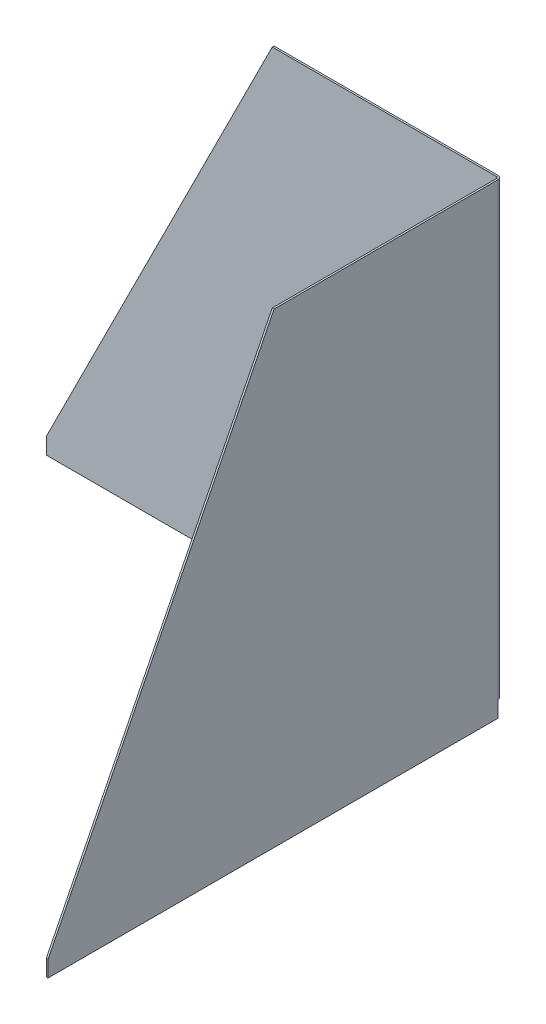
ISO-10303-21;
HEADER;
FILE_DESCRIPTION(('STEP AP214'),'2;1');
FILE_NAME('part.step','',(''),(''),'','','');
FILE_SCHEMA(('AUTOMOTIVE_DESIGN { 1 0 10303 214 1 1 1 1 }'));
ENDSEC;
DATA;
#1=APPLICATION_CONTEXT('core data for automotive mechanical design processes');
#2=APPLICATION_PROTOCOL_DEFINITION('international standard','automotive_design',2000,#1);
#3=PRODUCT_CONTEXT('',#1,'mechanical');
#4=PRODUCT('Part','Part','',(#3));
#5=PRODUCT_RELATED_PRODUCT_CATEGORY('part','',(#4));
#6=PRODUCT_DEFINITION_FORMATION('','',#4);
#7=PRODUCT_DEFINITION_CONTEXT('part definition',#1,'design');
#8=PRODUCT_DEFINITION('design','',#6,#7);
#9=PRODUCT_DEFINITION_SHAPE('','',#8);
#10=(LENGTH_UNIT() NAMED_UNIT(*) SI_UNIT(.MILLI.,.METRE.));
#11=(NAMED_UNIT(*) PLANE_ANGLE_UNIT() SI_UNIT($,.RADIAN.));
#12=(NAMED_UNIT(*) SI_UNIT($,.STERADIAN.) SOLID_ANGLE_UNIT());
#13=UNCERTAINTY_MEASURE_WITH_UNIT(LENGTH_MEASURE(1.E-05),#10,'distance_accuracy_value','');
#14=(GEOMETRIC_REPRESENTATION_CONTEXT(3) GLOBAL_UNCERTAINTY_ASSIGNED_CONTEXT((#13)) GLOBAL_UNIT_ASSIGNED_CONTEXT((#10,
#11,#12)) REPRESENTATION_CONTEXT('',''));
#15=CARTESIAN_POINT('',(0.,0.,0.));
#16=DIRECTION('',(0.,0.,1.));
#17=DIRECTION('',(1.,0.,0.));
#18=AXIS2_PLACEMENT_3D('',#15,#16,#17);
#19=CARTESIAN_POINT('',(-92.4999999999999,498.,92.4999999999999));
#20=DIRECTION('',(0.,-1.,0.));
#21=DIRECTION('',(0.,0.,1.));
#22=AXIS2_PLACEMENT_3D('',#19,#20,#21);
#23=PLANE('',#22);
#24=DIRECTION('',(1.,0.,0.));
#25=VECTOR('',#24,1.);
#26=CARTESIAN_POINT('',(-92.4999999999999,498.,94.4999999999999));
#27=LINE('',#26,#25);
#28=CARTESIAN_POINT('',(-92.4999999999999,498.,94.5));
#29=VERTEX_POINT('',#28);
#30=CARTESIAN_POINT('',(-90.4999999999999,498.,94.5));
#31=VERTEX_POINT('',#30);
#32=EDGE_CURVE('E138',#29,#31,#27,.T.);
#33=ORIENTED_EDGE('',*,*,#32,.F.);
#34=DIRECTION('',(0.,0.,1.));
#35=VECTOR('',#34,1.);
#36=CARTESIAN_POINT('',(-92.4999999999999,498.,92.4999999999999));
#37=LINE('',#36,#35);
#38=CARTESIAN_POINT('',(-92.4999999999999,498.,342.5));
#39=VERTEX_POINT('',#38);
#40=EDGE_CURVE('E155',#29,#39,#37,.T.);
#41=ORIENTED_EDGE('',*,*,#40,.T.);
#42=DIRECTION('',(1.,0.,0.));
#43=VECTOR('',#42,1.);
#44=CARTESIAN_POINT('',(-92.4999999999999,498.,342.5));
#45=LINE('',#44,#43);
#46=CARTESIAN_POINT('',(-90.4999999999999,498.,342.5));
#47=VERTEX_POINT('',#46);
#48=EDGE_CURVE('E58',#39,#47,#45,.T.);
#49=ORIENTED_EDGE('',*,*,#48,.T.);
#50=DIRECTION('',(0.,0.,1.));
#51=VECTOR('',#50,1.);
#52=CARTESIAN_POINT('',(-90.4999999999999,498.,0.));
#53=LINE('',#52,#51);
#54=EDGE_CURVE('E162',#31,#47,#53,.T.);
#55=ORIENTED_EDGE('',*,*,#54,.F.);
#56=EDGE_LOOP('',(#33,#41,#49,#55));
#57=FACE_BOUND('',#56,.T.);
#58=ADVANCED_FACE('F36',(#57),#23,.F.);
#59=CARTESIAN_POINT('',(-92.4999999999999,498.,342.5));
#60=DIRECTION('',(0.,-0.44864869521111,-0.893708200860532));
#61=DIRECTION('',(0.,-0.893708200860532,0.44864869521111));
#62=AXIS2_PLACEMENT_3D('',#59,#60,#61);
#63=PLANE('',#62);
#64=ORIENTED_EDGE('',*,*,#48,.F.);
#65=DIRECTION('',(0.,-0.893708200860532,0.44864869521111));
#66=VECTOR('',#65,1.);
#67=CARTESIAN_POINT('',(-92.4999999999999,498.,342.5));
#68=LINE('',#67,#66);
#69=CARTESIAN_POINT('',(-92.4999999999999,0.,592.5));
#70=VERTEX_POINT('',#69);
#71=EDGE_CURVE('E158',#39,#70,#68,.T.);
#72=ORIENTED_EDGE('',*,*,#71,.T.);
#73=DIRECTION('',(1.,0.,0.));
#74=VECTOR('',#73,1.);
#75=CARTESIAN_POINT('',(-92.4999999999999,0.,592.5));
#76=LINE('',#75,#74);
#77=CARTESIAN_POINT('',(-90.4999999999999,0.,592.5));
#78=VERTEX_POINT('',#77);
#79=EDGE_CURVE('E166',#70,#78,#76,.T.);
#80=ORIENTED_EDGE('',*,*,#79,.T.);
#81=DIRECTION('',(0.,-0.893708200860532,0.44864869521111));
#82=VECTOR('',#81,1.);
#83=CARTESIAN_POINT('',(-90.4999999999999,498.,342.5));
#84=LINE('',#83,#82);
#85=EDGE_CURVE('E159',#47,#78,#84,.T.);
#86=ORIENTED_EDGE('',*,*,#85,.F.);
#87=EDGE_LOOP('',(#64,#72,#80,#86));
#88=FACE_BOUND('',#87,.T.);
#89=ADVANCED_FACE('F251',(#88),#63,.F.);
#90=CARTESIAN_POINT('',(-90.4999999999999,0.,0.));
#91=DIRECTION('',(-1.,0.,0.));
#92=DIRECTION('',(0.,0.,1.));
#93=AXIS2_PLACEMENT_3D('',#90,#91,#92);
#94=PLANE('',#93);
#95=ORIENTED_EDGE('',*,*,#85,.T.);
#96=DIRECTION('',(0.,1.,0.));
#97=VECTOR('',#96,1.);
#98=CARTESIAN_POINT('',(-90.4999999999999,-18.,592.5));
#99=LINE('',#98,#97);
#100=CARTESIAN_POINT('',(-90.4999999999999,-18.,592.5));
#101=VERTEX_POINT('',#100);
#102=EDGE_CURVE('E178',#101,#78,#99,.T.);
#103=ORIENTED_EDGE('',*,*,#102,.F.);
#104=DIRECTION('',(0.,0.,1.));
#105=VECTOR('',#104,1.);
#106=CARTESIAN_POINT('',(-90.4999999999999,-18.,592.5));
#107=LINE('',#106,#105);
#108=CARTESIAN_POINT('',(-90.4999999999999,-18.,94.4999999999999));
#109=VERTEX_POINT('',#108);
#110=EDGE_CURVE('E183',#109,#101,#107,.T.);
#111=ORIENTED_EDGE('',*,*,#110,.F.);
#112=DIRECTION('',(0.,1.,0.));
#113=VECTOR('',#112,1.);
#114=CARTESIAN_POINT('',(-90.4999999999999,-18.,94.4999999999999));
#115=LINE('',#114,#113);
#116=CARTESIAN_POINT('',(-90.4999999999999,0.,94.4999999999999));
#117=VERTEX_POINT('',#116);
#118=EDGE_CURVE('E175',#109,#117,#115,.T.);
#119=ORIENTED_EDGE('',*,*,#118,.T.);
#120=DIRECTION('',(0.,1.,0.));
#121=VECTOR('',#120,1.);
#122=CARTESIAN_POINT('',(-90.4999999999999,0.,94.4999999999999));
#123=LINE('',#122,#121);
#124=EDGE_CURVE('E43',#117,#31,#123,.T.);
#125=ORIENTED_EDGE('',*,*,#124,.T.);
#126=ORIENTED_EDGE('',*,*,#54,.T.);
#127=EDGE_LOOP('',(#95,#103,#111,#119,#125,#126));
#128=FACE_BOUND('',#127,.T.);
#129=ADVANCED_FACE('F243',(#128),#94,.F.);
#130=CARTESIAN_POINT('',(-92.4999999999999,0.,0.));
#131=DIRECTION('',(-1.,0.,0.));
#132=DIRECTION('',(0.,0.,1.));
#133=AXIS2_PLACEMENT_3D('',#130,#131,#132);
#134=PLANE('',#133);
#135=DIRECTION('',(0.,1.,0.));
#136=VECTOR('',#135,1.);
#137=CARTESIAN_POINT('',(-92.4999999999999,0.,94.4999999999999));
#138=LINE('',#137,#136);
#139=CARTESIAN_POINT('',(-92.4999999999999,0.,94.5));
#140=VERTEX_POINT('',#139);
#141=EDGE_CURVE('E148',#140,#29,#138,.T.);
#142=ORIENTED_EDGE('',*,*,#141,.F.);
#143=DIRECTION('',(0.,1.,0.));
#144=VECTOR('',#143,1.);
#145=CARTESIAN_POINT('',(-92.4999999999999,-18.,94.4999999999999));
#146=LINE('',#145,#144);
#147=CARTESIAN_POINT('',(-92.4999999999999,-18.,94.4999999999999));
#148=VERTEX_POINT('',#147);
#149=EDGE_CURVE('E170',#148,#140,#146,.T.);
#150=ORIENTED_EDGE('',*,*,#149,.F.);
#151=DIRECTION('',(0.,0.,-1.));
#152=VECTOR('',#151,1.);
#153=CARTESIAN_POINT('',(-92.4999999999999,-18.,592.5));
#154=LINE('',#153,#152);
#155=CARTESIAN_POINT('',(-92.4999999999999,-18.,592.5));
#156=VERTEX_POINT('',#155);
#157=EDGE_CURVE('E187',#156,#148,#154,.T.);
#158=ORIENTED_EDGE('',*,*,#157,.F.);
#159=DIRECTION('',(0.,1.,0.));
#160=VECTOR('',#159,1.);
#161=CARTESIAN_POINT('',(-92.4999999999999,-18.,592.5));
#162=LINE('',#161,#160);
#163=EDGE_CURVE('E71',#156,#70,#162,.T.);
#164=ORIENTED_EDGE('',*,*,#163,.T.);
#165=ORIENTED_EDGE('',*,*,#71,.F.);
#166=ORIENTED_EDGE('',*,*,#40,.F.);
#167=EDGE_LOOP('',(#142,#150,#158,#164,#165,#166));
#168=FACE_BOUND('',#167,.T.);
#169=ADVANCED_FACE('F156',(#168),#134,.T.);
#170=CARTESIAN_POINT('',(-92.4999999999999,-18.,94.4999999999999));
#171=DIRECTION('',(0.,0.,1.));
#172=DIRECTION('',(0.,-1.,0.));
#173=AXIS2_PLACEMENT_3D('',#170,#171,#172);
#174=PLANE('',#173);
#175=DIRECTION('',(1.,0.,0.));
#176=VECTOR('',#175,1.);
#177=CARTESIAN_POINT('',(-92.4999999999999,0.,94.4999999999999));
#178=LINE('',#177,#176);
#179=EDGE_CURVE('E11',#140,#117,#178,.T.);
#180=ORIENTED_EDGE('',*,*,#179,.T.);
#181=ORIENTED_EDGE('',*,*,#118,.F.);
#182=DIRECTION('',(1.,0.,0.));
#183=VECTOR('',#182,1.);
#184=CARTESIAN_POINT('',(-92.4999999999999,-18.,94.4999999999999));
#185=LINE('',#184,#183);
#186=EDGE_CURVE('E185',#148,#109,#185,.T.);
#187=ORIENTED_EDGE('',*,*,#186,.F.);
#188=ORIENTED_EDGE('',*,*,#149,.T.);
#189=EDGE_LOOP('',(#180,#181,#187,#188));
#190=FACE_BOUND('',#189,.T.);
#191=ADVANCED_FACE('F246',(#190),#174,.F.);
#192=CARTESIAN_POINT('',(-92.4999999999999,-18.,592.5));
#193=DIRECTION('',(0.,0.,-1.));
#194=DIRECTION('',(0.,1.,0.));
#195=AXIS2_PLACEMENT_3D('',#192,#193,#194);
#196=PLANE('',#195);
#197=ORIENTED_EDGE('',*,*,#79,.F.);
#198=ORIENTED_EDGE('',*,*,#163,.F.);
#199=DIRECTION('',(-1.,0.,0.));
#200=VECTOR('',#199,1.);
#201=CARTESIAN_POINT('',(-92.4999999999999,-18.,592.5));
#202=LINE('',#201,#200);
#203=EDGE_CURVE('E79',#101,#156,#202,.T.);
#204=ORIENTED_EDGE('',*,*,#203,.F.);
#205=ORIENTED_EDGE('',*,*,#102,.T.);
#206=EDGE_LOOP('',(#197,#198,#204,#205));
#207=FACE_BOUND('',#206,.T.);
#208=ADVANCED_FACE('F249',(#207),#196,.F.);
#209=CARTESIAN_POINT('',(0.,-18.,0.));
#210=DIRECTION('',(0.,-1.,0.));
#211=DIRECTION('',(1.,0.,0.));
#212=AXIS2_PLACEMENT_3D('',#209,#210,#211);
#213=PLANE('',#212);
#214=ORIENTED_EDGE('',*,*,#157,.T.);
#215=ORIENTED_EDGE('',*,*,#186,.T.);
#216=ORIENTED_EDGE('',*,*,#110,.T.);
#217=ORIENTED_EDGE('',*,*,#203,.T.);
#218=EDGE_LOOP('',(#214,#215,#216,#217));
#219=FACE_BOUND('',#218,.T.);
#220=ADVANCED_FACE('F247',(#219),#213,.T.);
#221=CARTESIAN_POINT('',(0.,-18.,0.));
#222=DIRECTION('',(0.,-1.,0.));
#223=DIRECTION('',(1.,0.,0.));
#224=AXIS2_PLACEMENT_3D('',#221,#222,#223);
#225=PLANE('',#224);
#226=DIRECTION('',(0.,0.,-1.));
#227=VECTOR('',#226,1.);
#228=CARTESIAN_POINT('',(-592.5,-18.,92.5000000000001));
#229=LINE('',#228,#227);
#230=CARTESIAN_POINT('',(-592.5,-18.,92.5000000000001));
#231=VERTEX_POINT('',#230);
#232=CARTESIAN_POINT('',(-592.5,-18.,90.5));
#233=VERTEX_POINT('',#232);
#234=EDGE_CURVE('E194',#231,#233,#229,.T.);
#235=ORIENTED_EDGE('',*,*,#234,.T.);
#236=DIRECTION('',(1.,0.,0.));
#237=VECTOR('',#236,1.);
#238=CARTESIAN_POINT('',(-592.5,-18.,90.5));
#239=LINE('',#238,#237);
#240=CARTESIAN_POINT('',(-94.5,-18.,90.5));
#241=VERTEX_POINT('',#240);
#242=EDGE_CURVE('E197',#233,#241,#239,.T.);
#243=ORIENTED_EDGE('',*,*,#242,.T.);
#244=DIRECTION('',(0.,0.,1.));
#245=VECTOR('',#244,1.);
#246=CARTESIAN_POINT('',(-94.5,-18.,92.5000000000001));
#247=LINE('',#246,#245);
#248=CARTESIAN_POINT('',(-94.5,-18.,92.5000000000001));
#249=VERTEX_POINT('',#248);
#250=EDGE_CURVE('E199',#241,#249,#247,.T.);
#251=ORIENTED_EDGE('',*,*,#250,.T.);
#252=DIRECTION('',(-1.,0.,0.));
#253=VECTOR('',#252,1.);
#254=CARTESIAN_POINT('',(-592.5,-18.,92.5000000000001));
#255=LINE('',#254,#253);
#256=EDGE_CURVE('E201',#249,#231,#255,.T.);
#257=ORIENTED_EDGE('',*,*,#256,.T.);
#258=EDGE_LOOP('',(#235,#243,#251,#257));
#259=FACE_BOUND('',#258,.T.);
#260=ADVANCED_FACE('F267',(#259),#225,.T.);
#261=CARTESIAN_POINT('',(-592.5,-18.,92.5000000000001));
#262=DIRECTION('',(1.,0.,0.));
#263=DIRECTION('',(0.,1.,0.));
#264=AXIS2_PLACEMENT_3D('',#261,#262,#263);
#265=PLANE('',#264);
#266=DIRECTION('',(0.,0.,-1.));
#267=VECTOR('',#266,1.);
#268=CARTESIAN_POINT('',(-592.5,0.,92.5000000000001));
#269=LINE('',#268,#267);
#270=CARTESIAN_POINT('',(-592.5,0.,92.5000000000001));
#271=VERTEX_POINT('',#270);
#272=CARTESIAN_POINT('',(-592.5,0.,90.5));
#273=VERTEX_POINT('',#272);
#274=EDGE_CURVE('E203',#271,#273,#269,.T.);
#275=ORIENTED_EDGE('',*,*,#274,.T.);
#276=DIRECTION('',(0.,1.,0.));
#277=VECTOR('',#276,1.);
#278=CARTESIAN_POINT('',(-592.5,-18.,90.5));
#279=LINE('',#278,#277);
#280=EDGE_CURVE('E226',#233,#273,#279,.T.);
#281=ORIENTED_EDGE('',*,*,#280,.F.);
#282=ORIENTED_EDGE('',*,*,#234,.F.);
#283=DIRECTION('',(0.,1.,0.));
#284=VECTOR('',#283,1.);
#285=CARTESIAN_POINT('',(-592.5,-18.,92.5000000000001));
#286=LINE('',#285,#284);
#287=EDGE_CURVE('E206',#231,#271,#286,.T.);
#288=ORIENTED_EDGE('',*,*,#287,.T.);
#289=EDGE_LOOP('',(#275,#281,#282,#288));
#290=FACE_BOUND('',#289,.T.);
#291=ADVANCED_FACE('F287',(#290),#265,.F.);
#292=CARTESIAN_POINT('',(-592.5,0.,92.5000000000001));
#293=DIRECTION('',(0.893708200860531,-0.44864869521111,0.));
#294=DIRECTION('',(0.44864869521111,0.893708200860531,0.));
#295=AXIS2_PLACEMENT_3D('',#292,#293,#294);
#296=PLANE('',#295);
#297=ORIENTED_EDGE('',*,*,#274,.F.);
#298=DIRECTION('',(0.44864869521111,0.893708200860531,0.));
#299=VECTOR('',#298,1.);
#300=CARTESIAN_POINT('',(-592.5,0.,92.5000000000001));
#301=LINE('',#300,#299);
#302=CARTESIAN_POINT('',(-342.5,498.,92.5));
#303=VERTEX_POINT('',#302);
#304=EDGE_CURVE('E208',#271,#303,#301,.T.);
#305=ORIENTED_EDGE('',*,*,#304,.T.);
#306=DIRECTION('',(0.,0.,-1.));
#307=VECTOR('',#306,1.);
#308=CARTESIAN_POINT('',(-342.5,498.,92.5));
#309=LINE('',#308,#307);
#310=CARTESIAN_POINT('',(-342.5,498.,90.5));
#311=VERTEX_POINT('',#310);
#312=EDGE_CURVE('E211',#303,#311,#309,.T.);
#313=ORIENTED_EDGE('',*,*,#312,.T.);
#314=DIRECTION('',(0.44864869521111,0.893708200860531,0.));
#315=VECTOR('',#314,1.);
#316=CARTESIAN_POINT('',(-592.5,0.,90.5000000000001));
#317=LINE('',#316,#315);
#318=EDGE_CURVE('E228',#273,#311,#317,.T.);
#319=ORIENTED_EDGE('',*,*,#318,.F.);
#320=EDGE_LOOP('',(#297,#305,#313,#319));
#321=FACE_BOUND('',#320,.T.);
#322=ADVANCED_FACE('F283',(#321),#296,.F.);
#323=CARTESIAN_POINT('',(0.,0.,92.5));
#324=DIRECTION('',(0.,0.,1.));
#325=DIRECTION('',(1.,0.,0.));
#326=AXIS2_PLACEMENT_3D('',#323,#324,#325);
#327=PLANE('',#326);
#328=DIRECTION('',(1.,0.,0.));
#329=VECTOR('',#328,1.);
#330=CARTESIAN_POINT('',(-342.5,498.,92.5));
#331=LINE('',#330,#329);
#332=CARTESIAN_POINT('',(-94.4999999999999,498.,92.5));
#333=VERTEX_POINT('',#332);
#334=EDGE_CURVE('E216',#303,#333,#331,.T.);
#335=ORIENTED_EDGE('',*,*,#334,.F.);
#336=ORIENTED_EDGE('',*,*,#304,.F.);
#337=ORIENTED_EDGE('',*,*,#287,.F.);
#338=ORIENTED_EDGE('',*,*,#256,.F.);
#339=DIRECTION('',(0.,1.,0.));
#340=VECTOR('',#339,1.);
#341=CARTESIAN_POINT('',(-94.5,-18.,92.5000000000001));
#342=LINE('',#341,#340);
#343=CARTESIAN_POINT('',(-94.4999999999999,0.,92.5));
#344=VERTEX_POINT('',#343);
#345=EDGE_CURVE('E213',#249,#344,#342,.T.);
#346=ORIENTED_EDGE('',*,*,#345,.T.);
#347=DIRECTION('',(0.,-1.,0.));
#348=VECTOR('',#347,1.);
#349=CARTESIAN_POINT('',(-94.4999999999999,0.,92.5));
#350=LINE('',#349,#348);
#351=EDGE_CURVE('E190',#333,#344,#350,.T.);
#352=ORIENTED_EDGE('',*,*,#351,.F.);
#353=EDGE_LOOP('',(#335,#336,#337,#338,#346,#352));
#354=FACE_BOUND('',#353,.T.);
#355=ADVANCED_FACE('F279',(#354),#327,.T.);
#356=CARTESIAN_POINT('',(-342.5,498.,92.5));
#357=DIRECTION('',(0.,-1.,0.));
#358=DIRECTION('',(1.,0.,0.));
#359=AXIS2_PLACEMENT_3D('',#356,#357,#358);
#360=PLANE('',#359);
#361=ORIENTED_EDGE('',*,*,#312,.F.);
#362=ORIENTED_EDGE('',*,*,#334,.T.);
#363=DIRECTION('',(0.,0.,-1.));
#364=VECTOR('',#363,1.);
#365=CARTESIAN_POINT('',(-94.4999999999999,498.,92.5));
#366=LINE('',#365,#364);
#367=CARTESIAN_POINT('',(-94.4999999999999,498.,90.5));
#368=VERTEX_POINT('',#367);
#369=EDGE_CURVE('E140',#333,#368,#366,.T.);
#370=ORIENTED_EDGE('',*,*,#369,.T.);
#371=DIRECTION('',(1.,0.,0.));
#372=VECTOR('',#371,1.);
#373=CARTESIAN_POINT('',(0.,498.,90.5));
#374=LINE('',#373,#372);
#375=EDGE_CURVE('E220',#311,#368,#374,.T.);
#376=ORIENTED_EDGE('',*,*,#375,.F.);
#377=EDGE_LOOP('',(#361,#362,#370,#376));
#378=FACE_BOUND('',#377,.T.);
#379=ADVANCED_FACE('F275',(#378),#360,.F.);
#380=CARTESIAN_POINT('',(0.,0.,90.5));
#381=DIRECTION('',(0.,0.,1.));
#382=DIRECTION('',(1.,0.,0.));
#383=AXIS2_PLACEMENT_3D('',#380,#381,#382);
#384=PLANE('',#383);
#385=ORIENTED_EDGE('',*,*,#375,.T.);
#386=DIRECTION('',(0.,-1.,0.));
#387=VECTOR('',#386,1.);
#388=CARTESIAN_POINT('',(-94.4999999999999,0.,90.5));
#389=LINE('',#388,#387);
#390=CARTESIAN_POINT('',(-94.4999999999999,0.,90.5));
#391=VERTEX_POINT('',#390);
#392=EDGE_CURVE('E223',#368,#391,#389,.T.);
#393=ORIENTED_EDGE('',*,*,#392,.T.);
#394=DIRECTION('',(0.,1.,0.));
#395=VECTOR('',#394,1.);
#396=CARTESIAN_POINT('',(-94.5,-18.,90.5));
#397=LINE('',#396,#395);
#398=EDGE_CURVE('E189',#241,#391,#397,.T.);
#399=ORIENTED_EDGE('',*,*,#398,.F.);
#400=ORIENTED_EDGE('',*,*,#242,.F.);
#401=ORIENTED_EDGE('',*,*,#280,.T.);
#402=ORIENTED_EDGE('',*,*,#318,.T.);
#403=EDGE_LOOP('',(#385,#393,#399,#400,#401,#402));
#404=FACE_BOUND('',#403,.T.);
#405=ADVANCED_FACE('F271',(#404),#384,.F.);
#406=CARTESIAN_POINT('',(-94.5,-18.,92.5000000000001));
#407=DIRECTION('',(-1.,0.,0.));
#408=DIRECTION('',(0.,-1.,0.));
#409=AXIS2_PLACEMENT_3D('',#406,#407,#408);
#410=PLANE('',#409);
#411=DIRECTION('',(0.,0.,-1.));
#412=VECTOR('',#411,1.);
#413=CARTESIAN_POINT('',(-94.4999999999999,0.,92.5));
#414=LINE('',#413,#412);
#415=EDGE_CURVE('E192',#344,#391,#414,.T.);
#416=ORIENTED_EDGE('',*,*,#415,.F.);
#417=ORIENTED_EDGE('',*,*,#345,.F.);
#418=ORIENTED_EDGE('',*,*,#250,.F.);
#419=ORIENTED_EDGE('',*,*,#398,.T.);
#420=EDGE_LOOP('',(#416,#417,#418,#419));
#421=FACE_BOUND('',#420,.T.);
#422=ADVANCED_FACE('F268',(#421),#410,.F.);
#423=CARTESIAN_POINT('',(-94.4999999999999,498.,94.5));
#424=DIRECTION('',(0.,-1.,0.));
#425=DIRECTION('',(0.,0.,-1.));
#426=AXIS2_PLACEMENT_3D('',#423,#424,#425);
#427=PLANE('',#426);
#428=ORIENTED_EDGE('',*,*,#32,.T.);
#429=CARTESIAN_POINT('',(-94.4999999999999,498.,94.5));
#430=DIRECTION('',(0.,1.,0.));
#431=DIRECTION('',(-1.,0.,0.));
#432=AXIS2_PLACEMENT_3D('',#429,#430,#431);
#433=CIRCLE('',#432,4.);
#434=EDGE_CURVE('E233',#31,#368,#433,.T.);
#435=ORIENTED_EDGE('',*,*,#434,.T.);
#436=ORIENTED_EDGE('',*,*,#369,.F.);
#437=CARTESIAN_POINT('',(-94.4999999999999,498.,94.5));
#438=DIRECTION('',(0.,1.,0.));
#439=DIRECTION('',(0.,0.,1.));
#440=AXIS2_PLACEMENT_3D('',#437,#438,#439);
#441=CIRCLE('',#440,2.);
#442=EDGE_CURVE('E134',#29,#333,#441,.T.);
#443=ORIENTED_EDGE('',*,*,#442,.F.);
#444=EDGE_LOOP('',(#428,#435,#436,#443));
#445=FACE_BOUND('',#444,.T.);
#446=ADVANCED_FACE('F136',(#445),#427,.F.);
#447=CARTESIAN_POINT('',(-94.4999999999999,0.,94.5));
#448=DIRECTION('',(0.,1.,0.));
#449=DIRECTION('',(-1.,0.,0.));
#450=AXIS2_PLACEMENT_3D('',#447,#448,#449);
#451=PLANE('',#450);
#452=ORIENTED_EDGE('',*,*,#415,.T.);
#453=CARTESIAN_POINT('',(-94.5,0.,94.5));
#454=DIRECTION('',(0.,1.,0.));
#455=DIRECTION('',(-1.,0.,0.));
#456=AXIS2_PLACEMENT_3D('',#453,#454,#455);
#457=CIRCLE('',#456,4.);
#458=EDGE_CURVE('E144',#391,#117,#457,.F.);
#459=ORIENTED_EDGE('',*,*,#458,.T.);
#460=ORIENTED_EDGE('',*,*,#179,.F.);
#461=CARTESIAN_POINT('',(-94.4999999999999,0.,94.5));
#462=DIRECTION('',(0.,-1.,0.));
#463=DIRECTION('',(1.,0.,0.));
#464=AXIS2_PLACEMENT_3D('',#461,#462,#463);
#465=CIRCLE('',#464,1.99999999999999);
#466=EDGE_CURVE('E143',#344,#140,#465,.T.);
#467=ORIENTED_EDGE('',*,*,#466,.F.);
#468=EDGE_LOOP('',(#452,#459,#460,#467));
#469=FACE_BOUND('',#468,.T.);
#470=ADVANCED_FACE('F237',(#469),#451,.F.);
#471=CARTESIAN_POINT('',(-94.5,-249.020081441946,94.5));
#472=DIRECTION('',(0.,1.,0.));
#473=DIRECTION('',(-1.,0.,0.));
#474=AXIS2_PLACEMENT_3D('',#471,#472,#473);
#475=CYLINDRICAL_SURFACE('',#474,2.);
#476=ORIENTED_EDGE('',*,*,#466,.T.);
#477=ORIENTED_EDGE('',*,*,#141,.T.);
#478=ORIENTED_EDGE('',*,*,#442,.T.);
#479=ORIENTED_EDGE('',*,*,#351,.T.);
#480=EDGE_LOOP('',(#476,#477,#478,#479));
#481=FACE_BOUND('',#480,.T.);
#482=ADVANCED_FACE('F150',(#481),#475,.F.);
#483=CARTESIAN_POINT('',(-94.5,-249.020081441946,94.5));
#484=DIRECTION('',(0.,1.,0.));
#485=DIRECTION('',(-1.,0.,0.));
#486=AXIS2_PLACEMENT_3D('',#483,#484,#485);
#487=CYLINDRICAL_SURFACE('',#486,4.);
#488=ORIENTED_EDGE('',*,*,#458,.F.);
#489=ORIENTED_EDGE('',*,*,#392,.F.);
#490=ORIENTED_EDGE('',*,*,#434,.F.);
#491=ORIENTED_EDGE('',*,*,#124,.F.);
#492=EDGE_LOOP('',(#488,#489,#490,#491));
#493=FACE_BOUND('',#492,.T.);
#494=ADVANCED_FACE('F299',(#493),#487,.T.);
#495=CLOSED_SHELL('',(#58,#89,#129,#169,#191,#208,#220,#260,#291,#322,#355,#379,#405,#422,#446,
#470,#482,#494));
#496=MANIFOLD_SOLID_BREP('B2',#495);
#497=ADVANCED_BREP_SHAPE_REPRESENTATION('',(#18,#496),#14);
#498=SHAPE_DEFINITION_REPRESENTATION(#9,#497);
ENDSEC;
END-ISO-10303-21;
